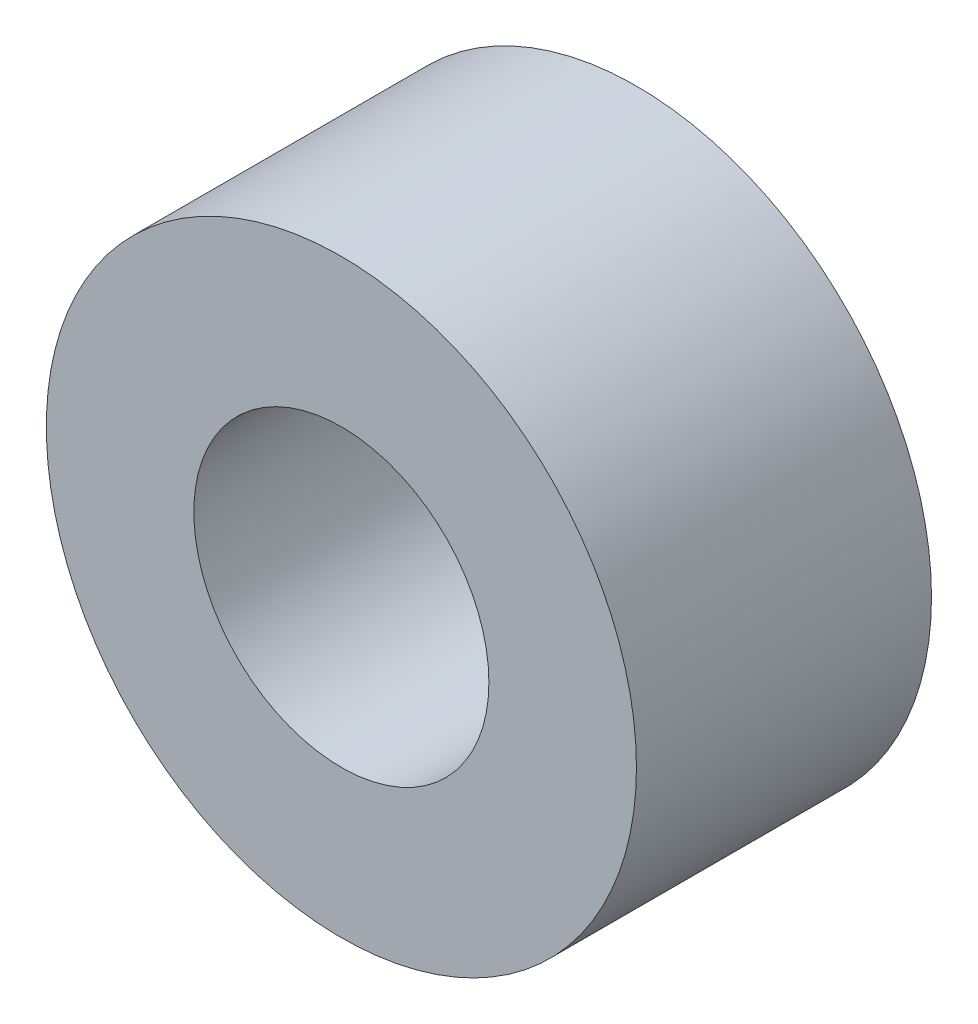
ISO-10303-21;
HEADER;
FILE_DESCRIPTION(('STEP AP214'),'2;1');
FILE_NAME('part.step','',(''),(''),'','','');
FILE_SCHEMA(('AUTOMOTIVE_DESIGN { 1 0 10303 214 1 1 1 1 }'));
ENDSEC;
DATA;
#1=APPLICATION_CONTEXT('core data for automotive mechanical design processes');
#2=APPLICATION_PROTOCOL_DEFINITION('international standard','automotive_design',2000,#1);
#3=PRODUCT_CONTEXT('',#1,'mechanical');
#4=PRODUCT('Part','Part','',(#3));
#5=PRODUCT_RELATED_PRODUCT_CATEGORY('part','',(#4));
#6=PRODUCT_DEFINITION_FORMATION('','',#4);
#7=PRODUCT_DEFINITION_CONTEXT('part definition',#1,'design');
#8=PRODUCT_DEFINITION('design','',#6,#7);
#9=PRODUCT_DEFINITION_SHAPE('','',#8);
#10=(LENGTH_UNIT() NAMED_UNIT(*) SI_UNIT(.MILLI.,.METRE.));
#11=(NAMED_UNIT(*) PLANE_ANGLE_UNIT() SI_UNIT($,.RADIAN.));
#12=(NAMED_UNIT(*) SI_UNIT($,.STERADIAN.) SOLID_ANGLE_UNIT());
#13=UNCERTAINTY_MEASURE_WITH_UNIT(LENGTH_MEASURE(1.E-05),#10,'distance_accuracy_value','');
#14=(GEOMETRIC_REPRESENTATION_CONTEXT(3) GLOBAL_UNCERTAINTY_ASSIGNED_CONTEXT((#13)) GLOBAL_UNIT_ASSIGNED_CONTEXT((#10,
#11,#12)) REPRESENTATION_CONTEXT('',''));
#15=CARTESIAN_POINT('',(0.,0.,0.));
#16=DIRECTION('',(0.,0.,1.));
#17=DIRECTION('',(1.,0.,0.));
#18=AXIS2_PLACEMENT_3D('',#15,#16,#17);
#19=CARTESIAN_POINT('',(0.,0.,6.35));
#20=DIRECTION('',(0.,0.,1.));
#21=DIRECTION('',(1.,0.,0.));
#22=AXIS2_PLACEMENT_3D('',#19,#20,#21);
#23=PLANE('',#22);
#24=CARTESIAN_POINT('',(0.,0.,6.35));
#25=DIRECTION('',(0.,0.,1.));
#26=DIRECTION('',(1.,0.,0.));
#27=AXIS2_PLACEMENT_3D('',#24,#25,#26);
#28=CIRCLE('',#27,6.34999999999999);
#29=CARTESIAN_POINT('',(6.34999999999999,0.,6.35));
#30=VERTEX_POINT('',#29);
#31=EDGE_CURVE('E10',#30,#30,#28,.T.);
#32=ORIENTED_EDGE('',*,*,#31,.T.);
#33=EDGE_LOOP('',(#32));
#34=FACE_BOUND('',#33,.T.);
#35=CARTESIAN_POINT('',(0.,0.,6.35));
#36=DIRECTION('',(0.,0.,1.));
#37=DIRECTION('',(1.,0.,0.));
#38=AXIS2_PLACEMENT_3D('',#35,#36,#37);
#39=CIRCLE('',#38,3.175);
#40=CARTESIAN_POINT('',(3.175,0.,6.35));
#41=VERTEX_POINT('',#40);
#42=EDGE_CURVE('E43',#41,#41,#39,.T.);
#43=ORIENTED_EDGE('',*,*,#42,.F.);
#44=EDGE_LOOP('',(#43));
#45=FACE_BOUND('',#44,.T.);
#46=ADVANCED_FACE('F32',(#34,#45),#23,.T.);
#47=CARTESIAN_POINT('',(0.,0.,0.));
#48=DIRECTION('',(0.,0.,1.));
#49=DIRECTION('',(1.,0.,0.));
#50=AXIS2_PLACEMENT_3D('',#47,#48,#49);
#51=PLANE('',#50);
#52=CARTESIAN_POINT('',(0.,0.,0.));
#53=DIRECTION('',(0.,0.,1.));
#54=DIRECTION('',(1.,0.,0.));
#55=AXIS2_PLACEMENT_3D('',#52,#53,#54);
#56=CIRCLE('',#55,6.34999999999999);
#57=CARTESIAN_POINT('',(6.34999999999999,0.,0.));
#58=VERTEX_POINT('',#57);
#59=EDGE_CURVE('E36',#58,#58,#56,.T.);
#60=ORIENTED_EDGE('',*,*,#59,.F.);
#61=EDGE_LOOP('',(#60));
#62=FACE_BOUND('',#61,.T.);
#63=CARTESIAN_POINT('',(0.,0.,0.));
#64=DIRECTION('',(0.,0.,1.));
#65=DIRECTION('',(1.,0.,0.));
#66=AXIS2_PLACEMENT_3D('',#63,#64,#65);
#67=CIRCLE('',#66,3.175);
#68=CARTESIAN_POINT('',(3.175,0.,0.));
#69=VERTEX_POINT('',#68);
#70=EDGE_CURVE('E45',#69,#69,#67,.T.);
#71=ORIENTED_EDGE('',*,*,#70,.T.);
#72=EDGE_LOOP('',(#71));
#73=FACE_BOUND('',#72,.T.);
#74=ADVANCED_FACE('F55',(#62,#73),#51,.F.);
#75=CARTESIAN_POINT('',(0.,0.,6.35));
#76=DIRECTION('',(0.,0.,-1.));
#77=DIRECTION('',(-1.,0.,0.));
#78=AXIS2_PLACEMENT_3D('',#75,#76,#77);
#79=CYLINDRICAL_SURFACE('',#78,6.34999999999999);
#80=ORIENTED_EDGE('',*,*,#31,.F.);
#81=EDGE_LOOP('',(#80));
#82=FACE_BOUND('',#81,.T.);
#83=ORIENTED_EDGE('',*,*,#59,.T.);
#84=EDGE_LOOP('',(#83));
#85=FACE_BOUND('',#84,.T.);
#86=ADVANCED_FACE('F34',(#82,#85),#79,.T.);
#87=CARTESIAN_POINT('',(0.,0.,6.35));
#88=DIRECTION('',(0.,0.,-1.));
#89=DIRECTION('',(-1.,0.,0.));
#90=AXIS2_PLACEMENT_3D('',#87,#88,#89);
#91=CYLINDRICAL_SURFACE('',#90,3.175);
#92=ORIENTED_EDGE('',*,*,#42,.T.);
#93=EDGE_LOOP('',(#92));
#94=FACE_BOUND('',#93,.T.);
#95=ORIENTED_EDGE('',*,*,#70,.F.);
#96=EDGE_LOOP('',(#95));
#97=FACE_BOUND('',#96,.T.);
#98=ADVANCED_FACE('F51',(#94,#97),#91,.F.);
#99=CLOSED_SHELL('',(#46,#74,#86,#98));
#100=MANIFOLD_SOLID_BREP('B2',#99);
#101=ADVANCED_BREP_SHAPE_REPRESENTATION('',(#18,#100),#14);
#102=SHAPE_DEFINITION_REPRESENTATION(#9,#101);
ENDSEC;
END-ISO-10303-21;
